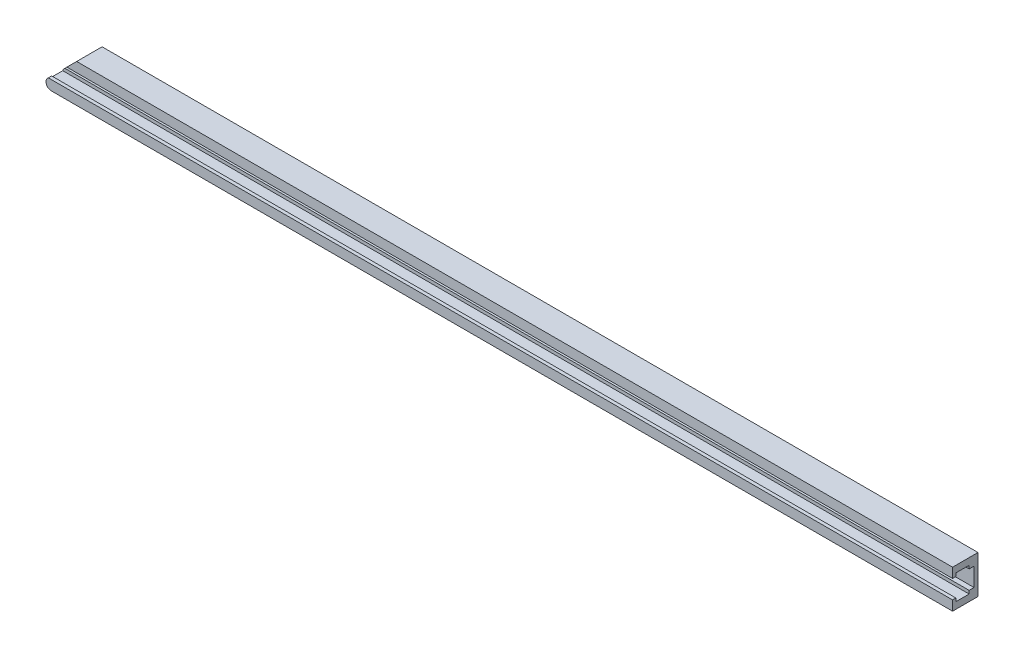
ISO-10303-21;
HEADER;
FILE_DESCRIPTION(('STEP AP214'),'2;1');
FILE_NAME('part.step','',(''),(''),'','','');
FILE_SCHEMA(('AUTOMOTIVE_DESIGN { 1 0 10303 214 1 1 1 1 }'));
ENDSEC;
DATA;
#1=APPLICATION_CONTEXT('core data for automotive mechanical design processes');
#2=APPLICATION_PROTOCOL_DEFINITION('international standard','automotive_design',2000,#1);
#3=PRODUCT_CONTEXT('',#1,'mechanical');
#4=PRODUCT('Part','Part','',(#3));
#5=PRODUCT_RELATED_PRODUCT_CATEGORY('part','',(#4));
#6=PRODUCT_DEFINITION_FORMATION('','',#4);
#7=PRODUCT_DEFINITION_CONTEXT('part definition',#1,'design');
#8=PRODUCT_DEFINITION('design','',#6,#7);
#9=PRODUCT_DEFINITION_SHAPE('','',#8);
#10=(LENGTH_UNIT() NAMED_UNIT(*) SI_UNIT(.MILLI.,.METRE.));
#11=(NAMED_UNIT(*) PLANE_ANGLE_UNIT() SI_UNIT($,.RADIAN.));
#12=(NAMED_UNIT(*) SI_UNIT($,.STERADIAN.) SOLID_ANGLE_UNIT());
#13=UNCERTAINTY_MEASURE_WITH_UNIT(LENGTH_MEASURE(1.E-05),#10,'distance_accuracy_value','');
#14=(GEOMETRIC_REPRESENTATION_CONTEXT(3) GLOBAL_UNCERTAINTY_ASSIGNED_CONTEXT((#13)) GLOBAL_UNIT_ASSIGNED_CONTEXT((#10,
#11,#12)) REPRESENTATION_CONTEXT('',''));
#15=CARTESIAN_POINT('',(0.,0.,0.));
#16=DIRECTION('',(0.,0.,1.));
#17=DIRECTION('',(1.,0.,0.));
#18=AXIS2_PLACEMENT_3D('',#15,#16,#17);
#19=CARTESIAN_POINT('',(-209.55,-9.14400000000005,0.));
#20=DIRECTION('',(0.707106781186551,-0.707106781186544,0.));
#21=DIRECTION('',(0.707106781186544,0.707106781186551,0.));
#22=AXIS2_PLACEMENT_3D('',#19,#20,#21);
#23=PLANE('',#22);
#24=DIRECTION('',(0.707106781186544,0.707106781186551,0.));
#25=VECTOR('',#24,1.);
#26=CARTESIAN_POINT('',(-209.55,-9.14400000000005,0.));
#27=LINE('',#26,#25);
#28=CARTESIAN_POINT('',(-205.213948775786,-4.80794877578618,0.));
#29=VERTEX_POINT('',#28);
#30=CARTESIAN_POINT('',(-191.262,9.144,0.));
#31=VERTEX_POINT('',#30);
#32=EDGE_CURVE('E173',#29,#31,#27,.T.);
#33=ORIENTED_EDGE('',*,*,#32,.F.);
#34=DIRECTION('',(0.,0.,1.));
#35=VECTOR('',#34,1.);
#36=CARTESIAN_POINT('',(-205.213948775786,-4.80794877578618,0.));
#37=LINE('',#36,#35);
#38=CARTESIAN_POINT('',(-205.213948775786,-4.80794877578622,4.2545));
#39=VERTEX_POINT('',#38);
#40=EDGE_CURVE('E219',#29,#39,#37,.T.);
#41=ORIENTED_EDGE('',*,*,#40,.T.);
#42=DIRECTION('',(-0.707106781186544,-0.707106781186551,0.));
#43=VECTOR('',#42,1.);
#44=CARTESIAN_POINT('',(11.8744999999978,212.2805,4.25450000000012));
#45=LINE('',#44,#43);
#46=CARTESIAN_POINT('',(-204.851,-4.445,4.2545));
#47=VERTEX_POINT('',#46);
#48=EDGE_CURVE('E252',#47,#39,#45,.T.);
#49=ORIENTED_EDGE('',*,*,#48,.F.);
#50=DIRECTION('',(0.,0.,1.));
#51=VECTOR('',#50,1.);
#52=CARTESIAN_POINT('',(-204.851,-4.445,1.90499999999968));
#53=LINE('',#52,#51);
#54=CARTESIAN_POINT('',(-204.851,-4.445,1.905));
#55=VERTEX_POINT('',#54);
#56=EDGE_CURVE('E265',#55,#47,#53,.T.);
#57=ORIENTED_EDGE('',*,*,#56,.F.);
#58=DIRECTION('',(-0.707106781186544,-0.707106781186551,0.));
#59=VECTOR('',#58,1.);
#60=CARTESIAN_POINT('',(16.3194999999977,216.7255,1.90500000000003));
#61=LINE('',#60,#59);
#62=CARTESIAN_POINT('',(-195.961,4.44499999999998,1.905));
#63=VERTEX_POINT('',#62);
#64=EDGE_CURVE('E268',#63,#55,#61,.T.);
#65=ORIENTED_EDGE('',*,*,#64,.F.);
#66=DIRECTION('',(0.,0.,-1.));
#67=VECTOR('',#66,1.);
#68=CARTESIAN_POINT('',(-195.961,4.445,4.2545));
#69=LINE('',#68,#67);
#70=CARTESIAN_POINT('',(-195.961,4.445,4.2545));
#71=VERTEX_POINT('',#70);
#72=EDGE_CURVE('E275',#71,#63,#69,.T.);
#73=ORIENTED_EDGE('',*,*,#72,.F.);
#74=DIRECTION('',(-0.707106781186544,-0.707106781186551,0.));
#75=VECTOR('',#74,1.);
#76=CARTESIAN_POINT('',(17.0814999999978,217.4875,4.2545));
#77=LINE('',#76,#75);
#78=CARTESIAN_POINT('',(-194.437,5.96899999999997,4.2545));
#79=VERTEX_POINT('',#78);
#80=EDGE_CURVE('E279',#79,#71,#77,.T.);
#81=ORIENTED_EDGE('',*,*,#80,.F.);
#82=DIRECTION('',(0.,0.,-1.));
#83=VECTOR('',#82,1.);
#84=CARTESIAN_POINT('',(-194.437,5.969,10.6044999999999));
#85=LINE('',#84,#83);
#86=CARTESIAN_POINT('',(-194.437,5.969,10.6045));
#87=VERTEX_POINT('',#86);
#88=EDGE_CURVE('E283',#87,#79,#85,.T.);
#89=ORIENTED_EDGE('',*,*,#88,.F.);
#90=DIRECTION('',(0.707106781186544,0.707106781186551,0.));
#91=VECTOR('',#90,1.);
#92=CARTESIAN_POINT('',(16.3194999999977,216.7255,10.6045));
#93=LINE('',#92,#91);
#94=CARTESIAN_POINT('',(-195.961,4.445,10.6045));
#95=VERTEX_POINT('',#94);
#96=EDGE_CURVE('E287',#95,#87,#93,.T.);
#97=ORIENTED_EDGE('',*,*,#96,.F.);
#98=DIRECTION('',(0.,0.,-1.));
#99=VECTOR('',#98,1.);
#100=CARTESIAN_POINT('',(-195.961,4.445,12.192));
#101=LINE('',#100,#99);
#102=CARTESIAN_POINT('',(-195.961,4.445,12.192));
#103=VERTEX_POINT('',#102);
#104=EDGE_CURVE('E291',#103,#95,#101,.T.);
#105=ORIENTED_EDGE('',*,*,#104,.F.);
#106=DIRECTION('',(0.707106781186544,0.707106781186551,0.));
#107=VECTOR('',#106,1.);
#108=CARTESIAN_POINT('',(-209.55,-9.14400000000005,12.192));
#109=LINE('',#108,#107);
#110=CARTESIAN_POINT('',(-191.262,9.144,12.192));
#111=VERTEX_POINT('',#110);
#112=EDGE_CURVE('E190',#103,#111,#109,.T.);
#113=ORIENTED_EDGE('',*,*,#112,.T.);
#114=DIRECTION('',(0.,0.,1.));
#115=VECTOR('',#114,1.);
#116=CARTESIAN_POINT('',(-191.262,9.144,0.));
#117=LINE('',#116,#115);
#118=EDGE_CURVE('E185',#31,#111,#117,.T.);
#119=ORIENTED_EDGE('',*,*,#118,.F.);
#120=EDGE_LOOP('',(#33,#41,#49,#57,#65,#73,#81,#89,#97,#105,#113,#119));
#121=FACE_BOUND('',#120,.T.);
#122=ADVANCED_FACE('F46',(#121),#23,.F.);
#123=CARTESIAN_POINT('',(228.6,-9.144,0.));
#124=DIRECTION('',(0.,0.,1.));
#125=DIRECTION('',(0.,-1.,0.));
#126=AXIS2_PLACEMENT_3D('',#123,#124,#125);
#127=PLANE('',#126);
#128=CARTESIAN_POINT('',(114.3,0.,0.));
#129=DIRECTION('',(0.,0.,1.));
#130=DIRECTION('',(0.,-1.,0.));
#131=AXIS2_PLACEMENT_3D('',#128,#129,#130);
#132=CIRCLE('',#131,2.413);
#133=CARTESIAN_POINT('',(114.3,-2.413,0.));
#134=VERTEX_POINT('',#133);
#135=EDGE_CURVE('E319',#134,#134,#132,.F.);
#136=ORIENTED_EDGE('',*,*,#135,.F.);
#137=EDGE_LOOP('',(#136));
#138=FACE_BOUND('',#137,.T.);
#139=CARTESIAN_POINT('',(38.1,0.,0.));
#140=DIRECTION('',(0.,0.,1.));
#141=DIRECTION('',(0.,-1.,0.));
#142=AXIS2_PLACEMENT_3D('',#139,#140,#141);
#143=CIRCLE('',#142,2.413);
#144=CARTESIAN_POINT('',(38.1,-2.413,0.));
#145=VERTEX_POINT('',#144);
#146=EDGE_CURVE('E331',#145,#145,#143,.F.);
#147=ORIENTED_EDGE('',*,*,#146,.F.);
#148=EDGE_LOOP('',(#147));
#149=FACE_BOUND('',#148,.T.);
#150=DIRECTION('',(-1.,0.,0.));
#151=VECTOR('',#150,1.);
#152=CARTESIAN_POINT('',(228.6,-9.144,0.));
#153=LINE('',#152,#151);
#154=CARTESIAN_POINT('',(228.6,-9.144,0.));
#155=VERTEX_POINT('',#154);
#156=CARTESIAN_POINT('',(-203.417897551572,-9.144,0.));
#157=VERTEX_POINT('',#156);
#158=EDGE_CURVE('E382',#155,#157,#153,.T.);
#159=ORIENTED_EDGE('',*,*,#158,.T.);
#160=CARTESIAN_POINT('',(-203.417897551572,-6.604,0.));
#161=DIRECTION('',(0.,0.,1.));
#162=DIRECTION('',(0.,-1.,0.));
#163=AXIS2_PLACEMENT_3D('',#160,#161,#162);
#164=CIRCLE('',#163,2.54);
#165=EDGE_CURVE('E12',#157,#29,#164,.F.);
#166=ORIENTED_EDGE('',*,*,#165,.T.);
#167=ORIENTED_EDGE('',*,*,#32,.T.);
#168=DIRECTION('',(-1.,0.,0.));
#169=VECTOR('',#168,1.);
#170=CARTESIAN_POINT('',(228.6,9.144,0.));
#171=LINE('',#170,#169);
#172=CARTESIAN_POINT('',(228.6,9.144,0.));
#173=VERTEX_POINT('',#172);
#174=EDGE_CURVE('E179',#173,#31,#171,.T.);
#175=ORIENTED_EDGE('',*,*,#174,.F.);
#176=DIRECTION('',(0.,1.,0.));
#177=VECTOR('',#176,1.);
#178=CARTESIAN_POINT('',(228.6,-9.144,0.));
#179=LINE('',#178,#177);
#180=EDGE_CURVE('E335',#155,#173,#179,.T.);
#181=ORIENTED_EDGE('',*,*,#180,.F.);
#182=EDGE_LOOP('',(#159,#166,#167,#175,#181));
#183=FACE_BOUND('',#182,.T.);
#184=CARTESIAN_POINT('',(190.5,0.,0.));
#185=DIRECTION('',(0.,0.,1.));
#186=DIRECTION('',(0.,-1.,0.));
#187=AXIS2_PLACEMENT_3D('',#184,#185,#186);
#188=CIRCLE('',#187,2.413);
#189=CARTESIAN_POINT('',(190.5,-2.413,0.));
#190=VERTEX_POINT('',#189);
#191=EDGE_CURVE('E201',#190,#190,#188,.F.);
#192=ORIENTED_EDGE('',*,*,#191,.F.);
#193=EDGE_LOOP('',(#192));
#194=FACE_BOUND('',#193,.T.);
#195=CARTESIAN_POINT('',(-114.3,0.,0.));
#196=DIRECTION('',(0.,0.,-1.));
#197=DIRECTION('',(0.,-1.,0.));
#198=AXIS2_PLACEMENT_3D('',#195,#196,#197);
#199=CIRCLE('',#198,2.413);
#200=CARTESIAN_POINT('',(-114.3,-2.413,0.));
#201=VERTEX_POINT('',#200);
#202=EDGE_CURVE('E295',#201,#201,#199,.F.);
#203=ORIENTED_EDGE('',*,*,#202,.T.);
#204=EDGE_LOOP('',(#203));
#205=FACE_BOUND('',#204,.T.);
#206=CARTESIAN_POINT('',(-38.1,0.,0.));
#207=DIRECTION('',(0.,0.,-1.));
#208=DIRECTION('',(0.,-1.,0.));
#209=AXIS2_PLACEMENT_3D('',#206,#207,#208);
#210=CIRCLE('',#209,2.413);
#211=CARTESIAN_POINT('',(-38.1,-2.413,0.));
#212=VERTEX_POINT('',#211);
#213=EDGE_CURVE('E307',#212,#212,#210,.F.);
#214=ORIENTED_EDGE('',*,*,#213,.T.);
#215=EDGE_LOOP('',(#214));
#216=FACE_BOUND('',#215,.T.);
#217=CARTESIAN_POINT('',(-190.5,0.,0.));
#218=DIRECTION('',(0.,0.,-1.));
#219=DIRECTION('',(0.,-1.,0.));
#220=AXIS2_PLACEMENT_3D('',#217,#218,#219);
#221=CIRCLE('',#220,2.413);
#222=CARTESIAN_POINT('',(-190.5,-2.413,0.));
#223=VERTEX_POINT('',#222);
#224=EDGE_CURVE('E311',#223,#223,#221,.F.);
#225=ORIENTED_EDGE('',*,*,#224,.T.);
#226=EDGE_LOOP('',(#225));
#227=FACE_BOUND('',#226,.T.);
#228=ADVANCED_FACE('F175',(#138,#149,#183,#194,#205,#216,#227),#127,.F.);
#229=CARTESIAN_POINT('',(228.6,9.144,0.));
#230=DIRECTION('',(0.,-1.,0.));
#231=DIRECTION('',(0.,0.,-1.));
#232=AXIS2_PLACEMENT_3D('',#229,#230,#231);
#233=PLANE('',#232);
#234=ORIENTED_EDGE('',*,*,#174,.T.);
#235=ORIENTED_EDGE('',*,*,#118,.T.);
#236=DIRECTION('',(-1.,0.,0.));
#237=VECTOR('',#236,1.);
#238=CARTESIAN_POINT('',(228.6,9.144,12.192));
#239=LINE('',#238,#237);
#240=CARTESIAN_POINT('',(228.6,9.144,12.192));
#241=VERTEX_POINT('',#240);
#242=EDGE_CURVE('E202',#241,#111,#239,.T.);
#243=ORIENTED_EDGE('',*,*,#242,.F.);
#244=DIRECTION('',(0.,0.,1.));
#245=VECTOR('',#244,1.);
#246=CARTESIAN_POINT('',(228.6,9.144,0.));
#247=LINE('',#246,#245);
#248=EDGE_CURVE('E198',#173,#241,#247,.T.);
#249=ORIENTED_EDGE('',*,*,#248,.F.);
#250=EDGE_LOOP('',(#234,#235,#243,#249));
#251=FACE_BOUND('',#250,.T.);
#252=ADVANCED_FACE('F197',(#251),#233,.F.);
#253=CARTESIAN_POINT('',(228.6,9.144,12.192));
#254=DIRECTION('',(0.,0.,-1.));
#255=DIRECTION('',(0.,1.,0.));
#256=AXIS2_PLACEMENT_3D('',#253,#254,#255);
#257=PLANE('',#256);
#258=ORIENTED_EDGE('',*,*,#242,.T.);
#259=ORIENTED_EDGE('',*,*,#112,.F.);
#260=DIRECTION('',(-1.,0.,0.));
#261=VECTOR('',#260,1.);
#262=CARTESIAN_POINT('',(228.6,4.445,12.192));
#263=LINE('',#262,#261);
#264=CARTESIAN_POINT('',(228.6,4.445,12.192));
#265=VERTEX_POINT('',#264);
#266=EDGE_CURVE('E209',#265,#103,#263,.T.);
#267=ORIENTED_EDGE('',*,*,#266,.F.);
#268=DIRECTION('',(0.,-1.,0.));
#269=VECTOR('',#268,1.);
#270=CARTESIAN_POINT('',(228.6,9.144,12.192));
#271=LINE('',#270,#269);
#272=EDGE_CURVE('E340',#241,#265,#271,.T.);
#273=ORIENTED_EDGE('',*,*,#272,.F.);
#274=EDGE_LOOP('',(#258,#259,#267,#273));
#275=FACE_BOUND('',#274,.T.);
#276=ADVANCED_FACE('F434',(#275),#257,.F.);
#277=CARTESIAN_POINT('',(228.6,4.445,12.192));
#278=DIRECTION('',(0.,1.,0.));
#279=DIRECTION('',(0.,0.,1.));
#280=AXIS2_PLACEMENT_3D('',#277,#278,#279);
#281=PLANE('',#280);
#282=ORIENTED_EDGE('',*,*,#266,.T.);
#283=ORIENTED_EDGE('',*,*,#104,.T.);
#284=DIRECTION('',(-1.,0.,0.));
#285=VECTOR('',#284,1.);
#286=CARTESIAN_POINT('',(228.6,4.445,10.6045));
#287=LINE('',#286,#285);
#288=CARTESIAN_POINT('',(228.6,4.445,10.6045));
#289=VERTEX_POINT('',#288);
#290=EDGE_CURVE('E422',#289,#95,#287,.T.);
#291=ORIENTED_EDGE('',*,*,#290,.F.);
#292=DIRECTION('',(0.,0.,-1.));
#293=VECTOR('',#292,1.);
#294=CARTESIAN_POINT('',(228.6,4.445,12.192));
#295=LINE('',#294,#293);
#296=EDGE_CURVE('E343',#265,#289,#295,.T.);
#297=ORIENTED_EDGE('',*,*,#296,.F.);
#298=EDGE_LOOP('',(#282,#283,#291,#297));
#299=FACE_BOUND('',#298,.T.);
#300=ADVANCED_FACE('F430',(#299),#281,.F.);
#301=CARTESIAN_POINT('',(228.6,4.445,10.6045));
#302=DIRECTION('',(0.,0.,1.));
#303=DIRECTION('',(1.,0.,0.));
#304=AXIS2_PLACEMENT_3D('',#301,#302,#303);
#305=PLANE('',#304);
#306=ORIENTED_EDGE('',*,*,#290,.T.);
#307=ORIENTED_EDGE('',*,*,#96,.T.);
#308=DIRECTION('',(-1.,0.,0.));
#309=VECTOR('',#308,1.);
#310=CARTESIAN_POINT('',(228.6,5.969,10.6045));
#311=LINE('',#310,#309);
#312=CARTESIAN_POINT('',(228.6,5.969,10.6045));
#313=VERTEX_POINT('',#312);
#314=EDGE_CURVE('E418',#313,#87,#311,.T.);
#315=ORIENTED_EDGE('',*,*,#314,.F.);
#316=DIRECTION('',(0.,1.,0.));
#317=VECTOR('',#316,1.);
#318=CARTESIAN_POINT('',(228.6,4.445,10.6045));
#319=LINE('',#318,#317);
#320=EDGE_CURVE('E346',#289,#313,#319,.T.);
#321=ORIENTED_EDGE('',*,*,#320,.F.);
#322=EDGE_LOOP('',(#306,#307,#315,#321));
#323=FACE_BOUND('',#322,.T.);
#324=ADVANCED_FACE('F552',(#323),#305,.F.);
#325=CARTESIAN_POINT('',(228.6,5.969,10.6045));
#326=DIRECTION('',(0.,1.,0.));
#327=DIRECTION('',(0.,0.,1.));
#328=AXIS2_PLACEMENT_3D('',#325,#326,#327);
#329=PLANE('',#328);
#330=ORIENTED_EDGE('',*,*,#314,.T.);
#331=ORIENTED_EDGE('',*,*,#88,.T.);
#332=DIRECTION('',(-1.,0.,0.));
#333=VECTOR('',#332,1.);
#334=CARTESIAN_POINT('',(228.6,5.969,4.2545));
#335=LINE('',#334,#333);
#336=CARTESIAN_POINT('',(228.6,5.969,4.2545));
#337=VERTEX_POINT('',#336);
#338=EDGE_CURVE('E414',#337,#79,#335,.T.);
#339=ORIENTED_EDGE('',*,*,#338,.F.);
#340=DIRECTION('',(0.,0.,-1.));
#341=VECTOR('',#340,1.);
#342=CARTESIAN_POINT('',(228.6,5.969,10.6045));
#343=LINE('',#342,#341);
#344=EDGE_CURVE('E349',#313,#337,#343,.T.);
#345=ORIENTED_EDGE('',*,*,#344,.F.);
#346=EDGE_LOOP('',(#330,#331,#339,#345));
#347=FACE_BOUND('',#346,.T.);
#348=ADVANCED_FACE('F543',(#347),#329,.F.);
#349=CARTESIAN_POINT('',(228.6,5.969,4.2545));
#350=DIRECTION('',(0.,0.,-1.));
#351=DIRECTION('',(-1.,0.,0.));
#352=AXIS2_PLACEMENT_3D('',#349,#350,#351);
#353=PLANE('',#352);
#354=ORIENTED_EDGE('',*,*,#338,.T.);
#355=ORIENTED_EDGE('',*,*,#80,.T.);
#356=DIRECTION('',(-1.,0.,0.));
#357=VECTOR('',#356,1.);
#358=CARTESIAN_POINT('',(228.6,4.445,4.2545));
#359=LINE('',#358,#357);
#360=CARTESIAN_POINT('',(228.6,4.445,4.2545));
#361=VERTEX_POINT('',#360);
#362=EDGE_CURVE('E410',#361,#71,#359,.T.);
#363=ORIENTED_EDGE('',*,*,#362,.F.);
#364=DIRECTION('',(0.,-1.,0.));
#365=VECTOR('',#364,1.);
#366=CARTESIAN_POINT('',(228.6,5.969,4.2545));
#367=LINE('',#366,#365);
#368=EDGE_CURVE('E352',#337,#361,#367,.T.);
#369=ORIENTED_EDGE('',*,*,#368,.F.);
#370=EDGE_LOOP('',(#354,#355,#363,#369));
#371=FACE_BOUND('',#370,.T.);
#372=ADVANCED_FACE('F534',(#371),#353,.F.);
#373=CARTESIAN_POINT('',(228.6,4.445,4.2545));
#374=DIRECTION('',(0.,1.,0.));
#375=DIRECTION('',(0.,0.,1.));
#376=AXIS2_PLACEMENT_3D('',#373,#374,#375);
#377=PLANE('',#376);
#378=ORIENTED_EDGE('',*,*,#362,.T.);
#379=ORIENTED_EDGE('',*,*,#72,.T.);
#380=DIRECTION('',(-1.,0.,0.));
#381=VECTOR('',#380,1.);
#382=CARTESIAN_POINT('',(228.6,4.445,1.905));
#383=LINE('',#382,#381);
#384=CARTESIAN_POINT('',(228.6,4.445,1.905));
#385=VERTEX_POINT('',#384);
#386=EDGE_CURVE('E406',#385,#63,#383,.T.);
#387=ORIENTED_EDGE('',*,*,#386,.F.);
#388=DIRECTION('',(0.,0.,-1.));
#389=VECTOR('',#388,1.);
#390=CARTESIAN_POINT('',(228.6,4.445,4.2545));
#391=LINE('',#390,#389);
#392=EDGE_CURVE('E355',#361,#385,#391,.T.);
#393=ORIENTED_EDGE('',*,*,#392,.F.);
#394=EDGE_LOOP('',(#378,#379,#387,#393));
#395=FACE_BOUND('',#394,.T.);
#396=ADVANCED_FACE('F525',(#395),#377,.F.);
#397=CARTESIAN_POINT('',(228.6,4.445,1.905));
#398=DIRECTION('',(0.,0.,-1.));
#399=DIRECTION('',(0.,1.,0.));
#400=AXIS2_PLACEMENT_3D('',#397,#398,#399);
#401=PLANE('',#400);
#402=CARTESIAN_POINT('',(114.3,0.,1.905));
#403=DIRECTION('',(0.,0.,1.));
#404=DIRECTION('',(1.,0.,0.));
#405=AXIS2_PLACEMENT_3D('',#402,#403,#404);
#406=CIRCLE('',#405,2.413);
#407=CARTESIAN_POINT('',(116.713,0.,1.905));
#408=VERTEX_POINT('',#407);
#409=EDGE_CURVE('E323',#408,#408,#406,.T.);
#410=ORIENTED_EDGE('',*,*,#409,.F.);
#411=EDGE_LOOP('',(#410));
#412=FACE_BOUND('',#411,.T.);
#413=CARTESIAN_POINT('',(38.1,0.,1.905));
#414=DIRECTION('',(0.,0.,1.));
#415=DIRECTION('',(1.,0.,0.));
#416=AXIS2_PLACEMENT_3D('',#413,#414,#415);
#417=CIRCLE('',#416,2.413);
#418=CARTESIAN_POINT('',(40.513,0.,1.905));
#419=VERTEX_POINT('',#418);
#420=EDGE_CURVE('E327',#419,#419,#417,.T.);
#421=ORIENTED_EDGE('',*,*,#420,.F.);
#422=EDGE_LOOP('',(#421));
#423=FACE_BOUND('',#422,.T.);
#424=ORIENTED_EDGE('',*,*,#386,.T.);
#425=ORIENTED_EDGE('',*,*,#64,.T.);
#426=DIRECTION('',(-1.,0.,0.));
#427=VECTOR('',#426,1.);
#428=CARTESIAN_POINT('',(228.6,-4.445,1.905));
#429=LINE('',#428,#427);
#430=CARTESIAN_POINT('',(228.6,-4.445,1.905));
#431=VERTEX_POINT('',#430);
#432=EDGE_CURVE('E402',#431,#55,#429,.T.);
#433=ORIENTED_EDGE('',*,*,#432,.F.);
#434=DIRECTION('',(0.,-1.,0.));
#435=VECTOR('',#434,1.);
#436=CARTESIAN_POINT('',(228.6,4.445,1.905));
#437=LINE('',#436,#435);
#438=EDGE_CURVE('E358',#385,#431,#437,.T.);
#439=ORIENTED_EDGE('',*,*,#438,.F.);
#440=EDGE_LOOP('',(#424,#425,#433,#439));
#441=FACE_BOUND('',#440,.T.);
#442=CARTESIAN_POINT('',(190.5,0.,1.905));
#443=DIRECTION('',(0.,0.,1.));
#444=DIRECTION('',(1.,0.,0.));
#445=AXIS2_PLACEMENT_3D('',#442,#443,#444);
#446=CIRCLE('',#445,2.413);
#447=CARTESIAN_POINT('',(192.913,0.,1.905));
#448=VERTEX_POINT('',#447);
#449=EDGE_CURVE('E207',#448,#448,#446,.T.);
#450=ORIENTED_EDGE('',*,*,#449,.F.);
#451=EDGE_LOOP('',(#450));
#452=FACE_BOUND('',#451,.T.);
#453=CARTESIAN_POINT('',(-114.3,0.,1.905));
#454=DIRECTION('',(0.,0.,-1.));
#455=DIRECTION('',(-1.,0.,0.));
#456=AXIS2_PLACEMENT_3D('',#453,#454,#455);
#457=CIRCLE('',#456,2.413);
#458=CARTESIAN_POINT('',(-116.713,0.,1.905));
#459=VERTEX_POINT('',#458);
#460=EDGE_CURVE('E299',#459,#459,#457,.T.);
#461=ORIENTED_EDGE('',*,*,#460,.T.);
#462=EDGE_LOOP('',(#461));
#463=FACE_BOUND('',#462,.T.);
#464=CARTESIAN_POINT('',(-38.1,0.,1.905));
#465=DIRECTION('',(0.,0.,-1.));
#466=DIRECTION('',(-1.,0.,0.));
#467=AXIS2_PLACEMENT_3D('',#464,#465,#466);
#468=CIRCLE('',#467,2.413);
#469=CARTESIAN_POINT('',(-40.513,0.,1.905));
#470=VERTEX_POINT('',#469);
#471=EDGE_CURVE('E303',#470,#470,#468,.T.);
#472=ORIENTED_EDGE('',*,*,#471,.T.);
#473=EDGE_LOOP('',(#472));
#474=FACE_BOUND('',#473,.T.);
#475=CARTESIAN_POINT('',(-190.5,0.,1.905));
#476=DIRECTION('',(0.,0.,-1.));
#477=DIRECTION('',(-1.,0.,0.));
#478=AXIS2_PLACEMENT_3D('',#475,#476,#477);
#479=CIRCLE('',#478,2.413);
#480=CARTESIAN_POINT('',(-192.913,0.,1.905));
#481=VERTEX_POINT('',#480);
#482=EDGE_CURVE('E315',#481,#481,#479,.T.);
#483=ORIENTED_EDGE('',*,*,#482,.T.);
#484=EDGE_LOOP('',(#483));
#485=FACE_BOUND('',#484,.T.);
#486=ADVANCED_FACE('F515',(#412,#423,#441,#452,#463,#474,#485),#401,.F.);
#487=CARTESIAN_POINT('',(228.6,-4.445,1.905));
#488=DIRECTION('',(0.,-1.,0.));
#489=DIRECTION('',(0.,0.,-1.));
#490=AXIS2_PLACEMENT_3D('',#487,#488,#489);
#491=PLANE('',#490);
#492=ORIENTED_EDGE('',*,*,#432,.T.);
#493=ORIENTED_EDGE('',*,*,#56,.T.);
#494=DIRECTION('',(-1.,0.,0.));
#495=VECTOR('',#494,1.);
#496=CARTESIAN_POINT('',(228.6,-4.445,4.2545));
#497=LINE('',#496,#495);
#498=CARTESIAN_POINT('',(228.6,-4.445,4.2545));
#499=VERTEX_POINT('',#498);
#500=EDGE_CURVE('E263',#499,#47,#497,.T.);
#501=ORIENTED_EDGE('',*,*,#500,.F.);
#502=DIRECTION('',(0.,0.,1.));
#503=VECTOR('',#502,1.);
#504=CARTESIAN_POINT('',(228.6,-4.445,1.905));
#505=LINE('',#504,#503);
#506=EDGE_CURVE('E361',#431,#499,#505,.T.);
#507=ORIENTED_EDGE('',*,*,#506,.F.);
#508=EDGE_LOOP('',(#492,#493,#501,#507));
#509=FACE_BOUND('',#508,.T.);
#510=ADVANCED_FACE('F458',(#509),#491,.F.);
#511=CARTESIAN_POINT('',(228.6,-4.445,4.2545));
#512=DIRECTION('',(0.,0.,-1.));
#513=DIRECTION('',(0.,1.,0.));
#514=AXIS2_PLACEMENT_3D('',#511,#512,#513);
#515=PLANE('',#514);
#516=ORIENTED_EDGE('',*,*,#48,.T.);
#517=CARTESIAN_POINT('',(-203.417897551572,-6.604,4.2545));
#518=DIRECTION('',(0.,0.,-1.));
#519=DIRECTION('',(0.,1.,0.));
#520=AXIS2_PLACEMENT_3D('',#517,#518,#519);
#521=CIRCLE('',#520,2.54);
#522=CARTESIAN_POINT('',(-205.877241976414,-5.969,4.2545));
#523=VERTEX_POINT('',#522);
#524=EDGE_CURVE('E222',#39,#523,#521,.F.);
#525=ORIENTED_EDGE('',*,*,#524,.T.);
#526=DIRECTION('',(-1.,0.,0.));
#527=VECTOR('',#526,1.);
#528=CARTESIAN_POINT('',(228.6,-5.969,4.2545));
#529=LINE('',#528,#527);
#530=CARTESIAN_POINT('',(228.6,-5.969,4.2545));
#531=VERTEX_POINT('',#530);
#532=EDGE_CURVE('E397',#531,#523,#529,.T.);
#533=ORIENTED_EDGE('',*,*,#532,.F.);
#534=DIRECTION('',(0.,-1.,0.));
#535=VECTOR('',#534,1.);
#536=CARTESIAN_POINT('',(228.6,-4.445,4.2545));
#537=LINE('',#536,#535);
#538=EDGE_CURVE('E364',#499,#531,#537,.T.);
#539=ORIENTED_EDGE('',*,*,#538,.F.);
#540=ORIENTED_EDGE('',*,*,#500,.T.);
#541=EDGE_LOOP('',(#516,#525,#533,#539,#540));
#542=FACE_BOUND('',#541,.T.);
#543=ADVANCED_FACE('F258',(#542),#515,.F.);
#544=CARTESIAN_POINT('',(228.6,-5.969,4.2545));
#545=DIRECTION('',(0.,-1.,0.));
#546=DIRECTION('',(0.,0.,-1.));
#547=AXIS2_PLACEMENT_3D('',#544,#545,#546);
#548=PLANE('',#547);
#549=ORIENTED_EDGE('',*,*,#532,.T.);
#550=DIRECTION('',(0.,0.,1.));
#551=VECTOR('',#550,1.);
#552=CARTESIAN_POINT('',(-205.877241976414,-5.969,4.2545));
#553=LINE('',#552,#551);
#554=CARTESIAN_POINT('',(-205.877241976414,-5.969,10.6045));
#555=VERTEX_POINT('',#554);
#556=EDGE_CURVE('E225',#523,#555,#553,.T.);
#557=ORIENTED_EDGE('',*,*,#556,.T.);
#558=DIRECTION('',(-1.,0.,0.));
#559=VECTOR('',#558,1.);
#560=CARTESIAN_POINT('',(228.6,-5.969,10.6045));
#561=LINE('',#560,#559);
#562=CARTESIAN_POINT('',(228.6,-5.969,10.6045));
#563=VERTEX_POINT('',#562);
#564=EDGE_CURVE('E243',#563,#555,#561,.T.);
#565=ORIENTED_EDGE('',*,*,#564,.F.);
#566=DIRECTION('',(0.,0.,1.));
#567=VECTOR('',#566,1.);
#568=CARTESIAN_POINT('',(228.6,-5.969,4.2545));
#569=LINE('',#568,#567);
#570=EDGE_CURVE('E367',#531,#563,#569,.T.);
#571=ORIENTED_EDGE('',*,*,#570,.F.);
#572=EDGE_LOOP('',(#549,#557,#565,#571));
#573=FACE_BOUND('',#572,.T.);
#574=ADVANCED_FACE('F450',(#573),#548,.F.);
#575=CARTESIAN_POINT('',(228.6,-5.969,10.6045));
#576=DIRECTION('',(0.,0.,1.));
#577=DIRECTION('',(1.,0.,0.));
#578=AXIS2_PLACEMENT_3D('',#575,#576,#577);
#579=PLANE('',#578);
#580=ORIENTED_EDGE('',*,*,#564,.T.);
#581=CARTESIAN_POINT('',(-203.417897551572,-6.604,10.6045));
#582=DIRECTION('',(0.,0.,1.));
#583=DIRECTION('',(1.,0.,0.));
#584=AXIS2_PLACEMENT_3D('',#581,#582,#583);
#585=CIRCLE('',#584,2.54);
#586=CARTESIAN_POINT('',(-205.213948775786,-4.80794877578622,10.6045));
#587=VERTEX_POINT('',#586);
#588=EDGE_CURVE('E228',#555,#587,#585,.F.);
#589=ORIENTED_EDGE('',*,*,#588,.T.);
#590=DIRECTION('',(0.707106781186544,0.707106781186551,0.));
#591=VECTOR('',#590,1.);
#592=CARTESIAN_POINT('',(11.1124999999977,211.5185,10.6045));
#593=LINE('',#592,#591);
#594=CARTESIAN_POINT('',(-204.851,-4.445,10.6045));
#595=VERTEX_POINT('',#594);
#596=EDGE_CURVE('E239',#587,#595,#593,.T.);
#597=ORIENTED_EDGE('',*,*,#596,.T.);
#598=DIRECTION('',(-1.,0.,0.));
#599=VECTOR('',#598,1.);
#600=CARTESIAN_POINT('',(228.6,-4.445,10.6045));
#601=LINE('',#600,#599);
#602=CARTESIAN_POINT('',(228.6,-4.445,10.6045));
#603=VERTEX_POINT('',#602);
#604=EDGE_CURVE('E392',#603,#595,#601,.T.);
#605=ORIENTED_EDGE('',*,*,#604,.F.);
#606=DIRECTION('',(0.,1.,0.));
#607=VECTOR('',#606,1.);
#608=CARTESIAN_POINT('',(228.6,-5.969,10.6045));
#609=LINE('',#608,#607);
#610=EDGE_CURVE('E370',#563,#603,#609,.T.);
#611=ORIENTED_EDGE('',*,*,#610,.F.);
#612=EDGE_LOOP('',(#580,#589,#597,#605,#611));
#613=FACE_BOUND('',#612,.T.);
#614=ADVANCED_FACE('F237',(#613),#579,.F.);
#615=CARTESIAN_POINT('',(228.6,-4.445,10.6045));
#616=DIRECTION('',(0.,-1.,0.));
#617=DIRECTION('',(0.,0.,-1.));
#618=AXIS2_PLACEMENT_3D('',#615,#616,#617);
#619=PLANE('',#618);
#620=ORIENTED_EDGE('',*,*,#604,.T.);
#621=DIRECTION('',(0.,0.,1.));
#622=VECTOR('',#621,1.);
#623=CARTESIAN_POINT('',(-204.851,-4.445,10.6044999999995));
#624=LINE('',#623,#622);
#625=CARTESIAN_POINT('',(-204.851,-4.44500000000004,12.192));
#626=VERTEX_POINT('',#625);
#627=EDGE_CURVE('E195',#595,#626,#624,.T.);
#628=ORIENTED_EDGE('',*,*,#627,.T.);
#629=DIRECTION('',(-1.,0.,0.));
#630=VECTOR('',#629,1.);
#631=CARTESIAN_POINT('',(228.6,-4.445,12.192));
#632=LINE('',#631,#630);
#633=CARTESIAN_POINT('',(228.6,-4.445,12.192));
#634=VERTEX_POINT('',#633);
#635=EDGE_CURVE('E388',#634,#626,#632,.T.);
#636=ORIENTED_EDGE('',*,*,#635,.F.);
#637=DIRECTION('',(0.,0.,1.));
#638=VECTOR('',#637,1.);
#639=CARTESIAN_POINT('',(228.6,-4.445,10.6045));
#640=LINE('',#639,#638);
#641=EDGE_CURVE('E373',#603,#634,#640,.T.);
#642=ORIENTED_EDGE('',*,*,#641,.F.);
#643=EDGE_LOOP('',(#620,#628,#636,#642));
#644=FACE_BOUND('',#643,.T.);
#645=ADVANCED_FACE('F441',(#644),#619,.F.);
#646=CARTESIAN_POINT('',(228.6,-4.445,12.192));
#647=DIRECTION('',(0.,0.,-1.));
#648=DIRECTION('',(0.,1.,0.));
#649=AXIS2_PLACEMENT_3D('',#646,#647,#648);
#650=PLANE('',#649);
#651=CARTESIAN_POINT('',(-205.213948775786,-4.80794877578619,12.192));
#652=VERTEX_POINT('',#651);
#653=EDGE_CURVE('E186',#652,#626,#109,.T.);
#654=ORIENTED_EDGE('',*,*,#653,.F.);
#655=CARTESIAN_POINT('',(-203.417897551572,-6.60400000000001,12.192));
#656=DIRECTION('',(0.,0.,-1.));
#657=DIRECTION('',(0.,1.,0.));
#658=AXIS2_PLACEMENT_3D('',#655,#656,#657);
#659=CIRCLE('',#658,2.54);
#660=CARTESIAN_POINT('',(-203.417897551572,-9.14400000000001,12.192));
#661=VERTEX_POINT('',#660);
#662=EDGE_CURVE('E69',#652,#661,#659,.F.);
#663=ORIENTED_EDGE('',*,*,#662,.T.);
#664=DIRECTION('',(-1.,0.,0.));
#665=VECTOR('',#664,1.);
#666=CARTESIAN_POINT('',(228.6,-9.14400000000001,12.192));
#667=LINE('',#666,#665);
#668=CARTESIAN_POINT('',(228.6,-9.14400000000001,12.192));
#669=VERTEX_POINT('',#668);
#670=EDGE_CURVE('E385',#669,#661,#667,.T.);
#671=ORIENTED_EDGE('',*,*,#670,.F.);
#672=DIRECTION('',(0.,-1.,0.));
#673=VECTOR('',#672,1.);
#674=CARTESIAN_POINT('',(228.6,-4.445,12.192));
#675=LINE('',#674,#673);
#676=EDGE_CURVE('E376',#634,#669,#675,.T.);
#677=ORIENTED_EDGE('',*,*,#676,.F.);
#678=ORIENTED_EDGE('',*,*,#635,.T.);
#679=EDGE_LOOP('',(#654,#663,#671,#677,#678));
#680=FACE_BOUND('',#679,.T.);
#681=ADVANCED_FACE('F444',(#680),#650,.F.);
#682=CARTESIAN_POINT('',(228.6,-9.14400000000001,12.192));
#683=DIRECTION('',(0.,1.,0.));
#684=DIRECTION('',(0.,0.,1.));
#685=AXIS2_PLACEMENT_3D('',#682,#683,#684);
#686=PLANE('',#685);
#687=ORIENTED_EDGE('',*,*,#670,.T.);
#688=DIRECTION('',(0.,0.,1.));
#689=VECTOR('',#688,1.);
#690=CARTESIAN_POINT('',(-203.417897551572,-9.14400000000001,12.1919999999997));
#691=LINE('',#690,#689);
#692=EDGE_CURVE('E55',#661,#157,#691,.F.);
#693=ORIENTED_EDGE('',*,*,#692,.T.);
#694=ORIENTED_EDGE('',*,*,#158,.F.);
#695=DIRECTION('',(0.,0.,-1.));
#696=VECTOR('',#695,1.);
#697=CARTESIAN_POINT('',(228.6,-9.14400000000001,12.192));
#698=LINE('',#697,#696);
#699=EDGE_CURVE('E379',#669,#155,#698,.T.);
#700=ORIENTED_EDGE('',*,*,#699,.F.);
#701=EDGE_LOOP('',(#687,#693,#694,#700));
#702=FACE_BOUND('',#701,.T.);
#703=ADVANCED_FACE('F500',(#702),#686,.F.);
#704=CARTESIAN_POINT('',(228.6,9.144,0.));
#705=DIRECTION('',(1.,0.,0.));
#706=DIRECTION('',(0.,0.,-1.));
#707=AXIS2_PLACEMENT_3D('',#704,#705,#706);
#708=PLANE('',#707);
#709=ORIENTED_EDGE('',*,*,#180,.T.);
#710=ORIENTED_EDGE('',*,*,#248,.T.);
#711=ORIENTED_EDGE('',*,*,#272,.T.);
#712=ORIENTED_EDGE('',*,*,#296,.T.);
#713=ORIENTED_EDGE('',*,*,#320,.T.);
#714=ORIENTED_EDGE('',*,*,#344,.T.);
#715=ORIENTED_EDGE('',*,*,#368,.T.);
#716=ORIENTED_EDGE('',*,*,#392,.T.);
#717=ORIENTED_EDGE('',*,*,#438,.T.);
#718=ORIENTED_EDGE('',*,*,#506,.T.);
#719=ORIENTED_EDGE('',*,*,#538,.T.);
#720=ORIENTED_EDGE('',*,*,#570,.T.);
#721=ORIENTED_EDGE('',*,*,#610,.T.);
#722=ORIENTED_EDGE('',*,*,#641,.T.);
#723=ORIENTED_EDGE('',*,*,#676,.T.);
#724=ORIENTED_EDGE('',*,*,#699,.T.);
#725=EDGE_LOOP('',(#709,#710,#711,#712,#713,#714,#715,#716,#717,#718,#719,#720,#721,#722,#723,#724));
#726=FACE_BOUND('',#725,.T.);
#727=ADVANCED_FACE('F447',(#726),#708,.T.);
#728=CARTESIAN_POINT('',(38.1,0.,-6.82499465201257));
#729=DIRECTION('',(0.,0.,1.));
#730=DIRECTION('',(1.,0.,0.));
#731=AXIS2_PLACEMENT_3D('',#728,#729,#730);
#732=CYLINDRICAL_SURFACE('',#731,2.413);
#733=ORIENTED_EDGE('',*,*,#146,.T.);
#734=EDGE_LOOP('',(#733));
#735=FACE_BOUND('',#734,.T.);
#736=ORIENTED_EDGE('',*,*,#420,.T.);
#737=EDGE_LOOP('',(#736));
#738=FACE_BOUND('',#737,.T.);
#739=ADVANCED_FACE('F493',(#735,#738),#732,.F.);
#740=CARTESIAN_POINT('',(114.3,0.,-6.82499465201257));
#741=DIRECTION('',(0.,0.,1.));
#742=DIRECTION('',(1.,0.,0.));
#743=AXIS2_PLACEMENT_3D('',#740,#741,#742);
#744=CYLINDRICAL_SURFACE('',#743,2.413);
#745=ORIENTED_EDGE('',*,*,#135,.T.);
#746=EDGE_LOOP('',(#745));
#747=FACE_BOUND('',#746,.T.);
#748=ORIENTED_EDGE('',*,*,#409,.T.);
#749=EDGE_LOOP('',(#748));
#750=FACE_BOUND('',#749,.T.);
#751=ADVANCED_FACE('F489',(#747,#750),#744,.F.);
#752=CARTESIAN_POINT('',(190.5,0.,-6.82499465201257));
#753=DIRECTION('',(0.,0.,1.));
#754=DIRECTION('',(1.,0.,0.));
#755=AXIS2_PLACEMENT_3D('',#752,#753,#754);
#756=CYLINDRICAL_SURFACE('',#755,2.413);
#757=ORIENTED_EDGE('',*,*,#191,.T.);
#758=EDGE_LOOP('',(#757));
#759=FACE_BOUND('',#758,.T.);
#760=ORIENTED_EDGE('',*,*,#449,.T.);
#761=EDGE_LOOP('',(#760));
#762=FACE_BOUND('',#761,.T.);
#763=ADVANCED_FACE('F492',(#759,#762),#756,.F.);
#764=CARTESIAN_POINT('',(-38.1,0.,-6.82499465201257));
#765=DIRECTION('',(0.,0.,1.));
#766=DIRECTION('',(-1.,0.,0.));
#767=AXIS2_PLACEMENT_3D('',#764,#765,#766);
#768=CYLINDRICAL_SURFACE('',#767,2.413);
#769=ORIENTED_EDGE('',*,*,#213,.F.);
#770=EDGE_LOOP('',(#769));
#771=FACE_BOUND('',#770,.T.);
#772=ORIENTED_EDGE('',*,*,#471,.F.);
#773=EDGE_LOOP('',(#772));
#774=FACE_BOUND('',#773,.T.);
#775=ADVANCED_FACE('F483',(#771,#774),#768,.F.);
#776=CARTESIAN_POINT('',(-114.3,0.,-6.82499465201257));
#777=DIRECTION('',(0.,0.,1.));
#778=DIRECTION('',(-1.,0.,0.));
#779=AXIS2_PLACEMENT_3D('',#776,#777,#778);
#780=CYLINDRICAL_SURFACE('',#779,2.413);
#781=ORIENTED_EDGE('',*,*,#202,.F.);
#782=EDGE_LOOP('',(#781));
#783=FACE_BOUND('',#782,.T.);
#784=ORIENTED_EDGE('',*,*,#460,.F.);
#785=EDGE_LOOP('',(#784));
#786=FACE_BOUND('',#785,.T.);
#787=ADVANCED_FACE('F476',(#783,#786),#780,.F.);
#788=CARTESIAN_POINT('',(-190.5,0.,-6.82499465201257));
#789=DIRECTION('',(0.,0.,1.));
#790=DIRECTION('',(-1.,0.,0.));
#791=AXIS2_PLACEMENT_3D('',#788,#789,#790);
#792=CYLINDRICAL_SURFACE('',#791,2.413);
#793=ORIENTED_EDGE('',*,*,#224,.F.);
#794=EDGE_LOOP('',(#793));
#795=FACE_BOUND('',#794,.T.);
#796=ORIENTED_EDGE('',*,*,#482,.F.);
#797=EDGE_LOOP('',(#796));
#798=FACE_BOUND('',#797,.T.);
#799=ADVANCED_FACE('F470',(#795,#798),#792,.F.);
#800=ORIENTED_EDGE('',*,*,#596,.F.);
#801=DIRECTION('',(0.,0.,1.));
#802=VECTOR('',#801,1.);
#803=CARTESIAN_POINT('',(-205.213948775786,-4.80794877578618,0.));
#804=LINE('',#803,#802);
#805=EDGE_CURVE('E216',#587,#652,#804,.T.);
#806=ORIENTED_EDGE('',*,*,#805,.T.);
#807=ORIENTED_EDGE('',*,*,#653,.T.);
#808=ORIENTED_EDGE('',*,*,#627,.F.);
#809=EDGE_LOOP('',(#800,#806,#807,#808));
#810=FACE_BOUND('',#809,.T.);
#811=ADVANCED_FACE('F248',(#810),#23,.F.);
#812=CARTESIAN_POINT('',(-203.417897551572,-6.604,0.));
#813=DIRECTION('',(0.,0.,1.));
#814=DIRECTION('',(0.,-1.,0.));
#815=AXIS2_PLACEMENT_3D('',#812,#813,#814);
#816=CYLINDRICAL_SURFACE('',#815,2.54);
#817=ORIENTED_EDGE('',*,*,#165,.F.);
#818=ORIENTED_EDGE('',*,*,#692,.F.);
#819=ORIENTED_EDGE('',*,*,#662,.F.);
#820=ORIENTED_EDGE('',*,*,#805,.F.);
#821=ORIENTED_EDGE('',*,*,#588,.F.);
#822=ORIENTED_EDGE('',*,*,#556,.F.);
#823=ORIENTED_EDGE('',*,*,#524,.F.);
#824=ORIENTED_EDGE('',*,*,#40,.F.);
#825=EDGE_LOOP('',(#817,#818,#819,#820,#821,#822,#823,#824));
#826=FACE_BOUND('',#825,.T.);
#827=ADVANCED_FACE('F48',(#826),#816,.T.);
#828=CLOSED_SHELL('',(#122,#228,#252,#276,#300,#324,#348,#372,#396,#486,#510,#543,#574,#614,
#645,#681,#703,#727,#739,#751,#763,#775,#787,#799,#811,#827));
#829=MANIFOLD_SOLID_BREP('B2',#828);
#830=ADVANCED_BREP_SHAPE_REPRESENTATION('',(#18,#829),#14);
#831=SHAPE_DEFINITION_REPRESENTATION(#9,#830);
ENDSEC;
END-ISO-10303-21;
